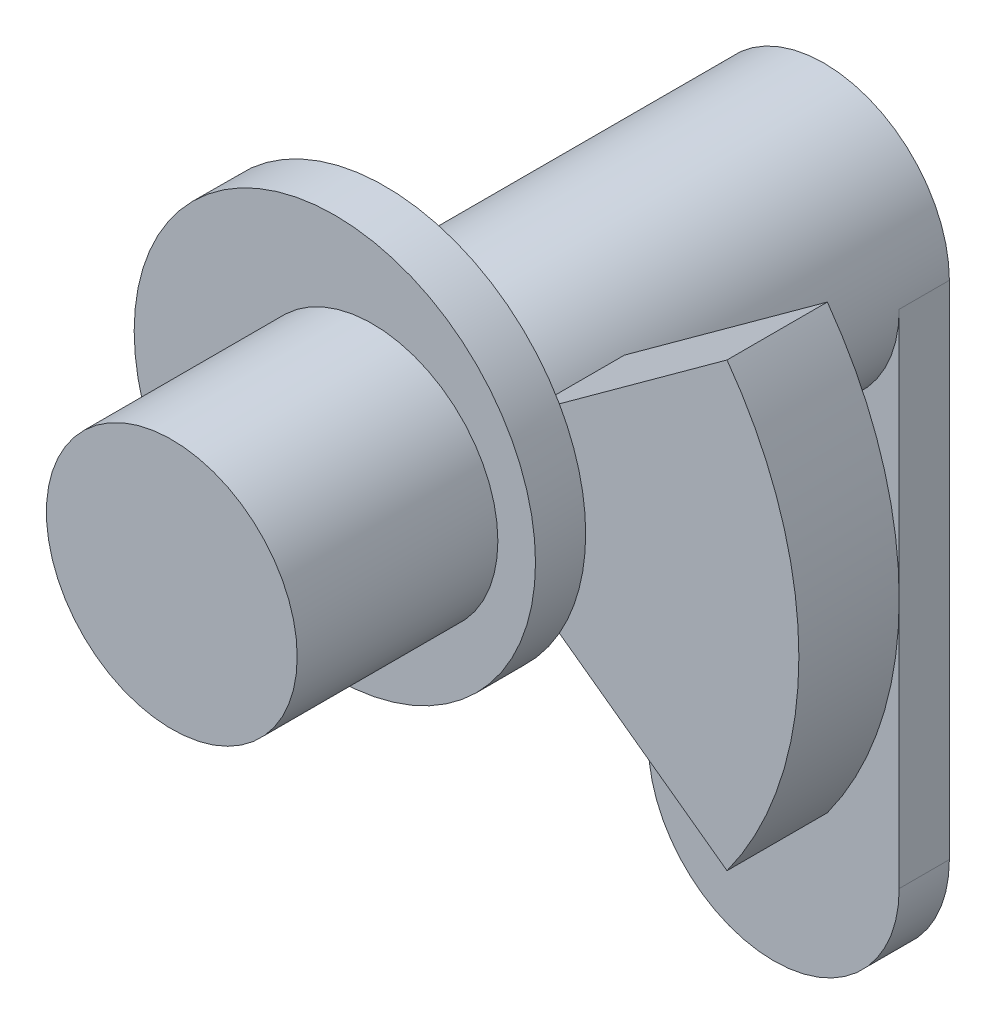
ISO-10303-21;
HEADER;
FILE_DESCRIPTION(('STEP AP214'),'2;1');
FILE_NAME('part.step','',(''),(''),'','','');
FILE_SCHEMA(('AUTOMOTIVE_DESIGN { 1 0 10303 214 1 1 1 1 }'));
ENDSEC;
DATA;
#1=APPLICATION_CONTEXT('core data for automotive mechanical design processes');
#2=APPLICATION_PROTOCOL_DEFINITION('international standard','automotive_design',2000,#1);
#3=PRODUCT_CONTEXT('',#1,'mechanical');
#4=PRODUCT('Part','Part','',(#3));
#5=PRODUCT_RELATED_PRODUCT_CATEGORY('part','',(#4));
#6=PRODUCT_DEFINITION_FORMATION('','',#4);
#7=PRODUCT_DEFINITION_CONTEXT('part definition',#1,'design');
#8=PRODUCT_DEFINITION('design','',#6,#7);
#9=PRODUCT_DEFINITION_SHAPE('','',#8);
#10=(LENGTH_UNIT() NAMED_UNIT(*) SI_UNIT(.MILLI.,.METRE.));
#11=(NAMED_UNIT(*) PLANE_ANGLE_UNIT() SI_UNIT($,.RADIAN.));
#12=(NAMED_UNIT(*) SI_UNIT($,.STERADIAN.) SOLID_ANGLE_UNIT());
#13=UNCERTAINTY_MEASURE_WITH_UNIT(LENGTH_MEASURE(1.E-05),#10,'distance_accuracy_value','');
#14=(GEOMETRIC_REPRESENTATION_CONTEXT(3) GLOBAL_UNCERTAINTY_ASSIGNED_CONTEXT((#13)) GLOBAL_UNIT_ASSIGNED_CONTEXT((#10,
#11,#12)) REPRESENTATION_CONTEXT('',''));
#15=CARTESIAN_POINT('',(0.,0.,0.));
#16=DIRECTION('',(0.,0.,1.));
#17=DIRECTION('',(1.,0.,0.));
#18=AXIS2_PLACEMENT_3D('',#15,#16,#17);
#19=CARTESIAN_POINT('',(0.,0.,330.2));
#20=DIRECTION('',(0.,0.,-1.));
#21=DIRECTION('',(-1.,0.,0.));
#22=AXIS2_PLACEMENT_3D('',#19,#20,#21);
#23=CYLINDRICAL_SURFACE('',#22,63.5);
#24=CARTESIAN_POINT('',(0.,0.,25.4));
#25=DIRECTION('',(0.,0.,-1.));
#26=DIRECTION('',(-1.,0.,0.));
#27=AXIS2_PLACEMENT_3D('',#24,#25,#26);
#28=CIRCLE('',#27,63.5);
#29=CARTESIAN_POINT('',(63.5,0.,25.4));
#30=VERTEX_POINT('',#29);
#31=CARTESIAN_POINT('',(-63.5,0.,25.4));
#32=VERTEX_POINT('',#31);
#33=EDGE_CURVE('E179',#30,#32,#28,.T.);
#34=ORIENTED_EDGE('',*,*,#33,.F.);
#35=DIRECTION('',(0.,0.,-1.));
#36=VECTOR('',#35,1.);
#37=CARTESIAN_POINT('',(63.5,0.,25.4));
#38=LINE('',#37,#36);
#39=CARTESIAN_POINT('',(63.5,0.,0.));
#40=VERTEX_POINT('',#39);
#41=EDGE_CURVE('E159',#30,#40,#38,.T.);
#42=ORIENTED_EDGE('',*,*,#41,.T.);
#43=CARTESIAN_POINT('',(0.,0.,0.));
#44=DIRECTION('',(0.,0.,1.));
#45=DIRECTION('',(1.,0.,0.));
#46=AXIS2_PLACEMENT_3D('',#43,#44,#45);
#47=CIRCLE('',#46,63.5);
#48=CARTESIAN_POINT('',(-63.5,0.,0.));
#49=VERTEX_POINT('',#48);
#50=EDGE_CURVE('E169',#40,#49,#47,.T.);
#51=ORIENTED_EDGE('',*,*,#50,.T.);
#52=DIRECTION('',(0.,0.,-1.));
#53=VECTOR('',#52,1.);
#54=CARTESIAN_POINT('',(-63.5,0.,25.4));
#55=LINE('',#54,#53);
#56=EDGE_CURVE('E58',#32,#49,#55,.T.);
#57=ORIENTED_EDGE('',*,*,#56,.F.);
#58=EDGE_LOOP('',(#34,#42,#51,#57));
#59=FACE_BOUND('',#58,.T.);
#60=CARTESIAN_POINT('',(0.,0.,152.4));
#61=DIRECTION('',(0.,0.,1.));
#62=DIRECTION('',(1.,0.,0.));
#63=AXIS2_PLACEMENT_3D('',#60,#61,#62);
#64=CIRCLE('',#63,63.5);
#65=CARTESIAN_POINT('',(51.3725791428088,-37.3243635205725,152.4));
#66=VERTEX_POINT('',#65);
#67=CARTESIAN_POINT('',(51.3725791428094,37.3243635205718,152.4));
#68=VERTEX_POINT('',#67);
#69=EDGE_CURVE('E11',#66,#68,#64,.T.);
#70=ORIENTED_EDGE('',*,*,#69,.F.);
#71=DIRECTION('',(0.,0.,-1.));
#72=VECTOR('',#71,1.);
#73=CARTESIAN_POINT('',(51.3725791428088,-37.3243635205725,330.2));
#74=LINE('',#73,#72);
#75=CARTESIAN_POINT('',(51.3725791428088,-37.3243635205725,203.2));
#76=VERTEX_POINT('',#75);
#77=EDGE_CURVE('E113',#66,#76,#74,.F.);
#78=ORIENTED_EDGE('',*,*,#77,.T.);
#79=CARTESIAN_POINT('',(0.,0.,203.2));
#80=DIRECTION('',(0.,0.,1.));
#81=DIRECTION('',(1.,0.,0.));
#82=AXIS2_PLACEMENT_3D('',#79,#80,#81);
#83=CIRCLE('',#82,63.5);
#84=CARTESIAN_POINT('',(51.3725791428094,37.3243635205718,203.2));
#85=VERTEX_POINT('',#84);
#86=EDGE_CURVE('E182',#85,#76,#83,.T.);
#87=ORIENTED_EDGE('',*,*,#86,.F.);
#88=DIRECTION('',(0.,0.,-1.));
#89=VECTOR('',#88,1.);
#90=CARTESIAN_POINT('',(51.3725791428094,37.3243635205718,330.2));
#91=LINE('',#90,#89);
#92=EDGE_CURVE('E50',#85,#68,#91,.T.);
#93=ORIENTED_EDGE('',*,*,#92,.T.);
#94=EDGE_LOOP('',(#70,#78,#87,#93));
#95=FACE_BOUND('',#94,.T.);
#96=ADVANCED_FACE('F35',(#59,#95),#23,.T.);
#97=CARTESIAN_POINT('',(0.,0.,0.));
#98=DIRECTION('',(0.,0.,1.));
#99=DIRECTION('',(1.,0.,0.));
#100=AXIS2_PLACEMENT_3D('',#97,#98,#99);
#101=PLANE('',#100);
#102=ORIENTED_EDGE('',*,*,#50,.F.);
#103=DIRECTION('',(0.,-1.,0.));
#104=VECTOR('',#103,1.);
#105=CARTESIAN_POINT('',(63.5,0.,0.));
#106=LINE('',#105,#104);
#107=CARTESIAN_POINT('',(63.5,-254.,0.));
#108=VERTEX_POINT('',#107);
#109=EDGE_CURVE('E160',#40,#108,#106,.T.);
#110=ORIENTED_EDGE('',*,*,#109,.T.);
#111=CARTESIAN_POINT('',(0.,-254.,0.));
#112=DIRECTION('',(0.,0.,-1.));
#113=DIRECTION('',(-1.,0.,0.));
#114=AXIS2_PLACEMENT_3D('',#111,#112,#113);
#115=CIRCLE('',#114,63.5);
#116=CARTESIAN_POINT('',(-63.5,-254.,0.));
#117=VERTEX_POINT('',#116);
#118=EDGE_CURVE('E163',#108,#117,#115,.T.);
#119=ORIENTED_EDGE('',*,*,#118,.T.);
#120=DIRECTION('',(0.,1.,0.));
#121=VECTOR('',#120,1.);
#122=CARTESIAN_POINT('',(-63.5,0.,0.));
#123=LINE('',#122,#121);
#124=EDGE_CURVE('E153',#117,#49,#123,.T.);
#125=ORIENTED_EDGE('',*,*,#124,.T.);
#126=EDGE_LOOP('',(#102,#110,#119,#125));
#127=FACE_BOUND('',#126,.T.);
#128=ADVANCED_FACE('F203',(#127),#101,.F.);
#129=CARTESIAN_POINT('',(-63.5,0.,25.4));
#130=DIRECTION('',(-1.,0.,0.));
#131=DIRECTION('',(0.,-1.,0.));
#132=AXIS2_PLACEMENT_3D('',#129,#130,#131);
#133=PLANE('',#132);
#134=ORIENTED_EDGE('',*,*,#124,.F.);
#135=DIRECTION('',(0.,0.,-1.));
#136=VECTOR('',#135,1.);
#137=CARTESIAN_POINT('',(-63.5,-254.,25.4));
#138=LINE('',#137,#136);
#139=CARTESIAN_POINT('',(-63.5,-254.,25.4));
#140=VERTEX_POINT('',#139);
#141=EDGE_CURVE('E170',#140,#117,#138,.T.);
#142=ORIENTED_EDGE('',*,*,#141,.F.);
#143=DIRECTION('',(0.,1.,0.));
#144=VECTOR('',#143,1.);
#145=CARTESIAN_POINT('',(-63.5,0.,25.4));
#146=LINE('',#145,#144);
#147=EDGE_CURVE('E156',#140,#32,#146,.T.);
#148=ORIENTED_EDGE('',*,*,#147,.T.);
#149=ORIENTED_EDGE('',*,*,#56,.T.);
#150=EDGE_LOOP('',(#134,#142,#148,#149));
#151=FACE_BOUND('',#150,.T.);
#152=ADVANCED_FACE('F207',(#151),#133,.T.);
#153=CARTESIAN_POINT('',(0.,-254.,25.4));
#154=DIRECTION('',(0.,0.,-1.));
#155=DIRECTION('',(-1.,0.,0.));
#156=AXIS2_PLACEMENT_3D('',#153,#154,#155);
#157=CYLINDRICAL_SURFACE('',#156,63.5);
#158=ORIENTED_EDGE('',*,*,#118,.F.);
#159=DIRECTION('',(0.,0.,-1.));
#160=VECTOR('',#159,1.);
#161=CARTESIAN_POINT('',(63.5,-254.,25.4));
#162=LINE('',#161,#160);
#163=CARTESIAN_POINT('',(63.5,-254.,25.4));
#164=VERTEX_POINT('',#163);
#165=EDGE_CURVE('E172',#164,#108,#162,.T.);
#166=ORIENTED_EDGE('',*,*,#165,.F.);
#167=CARTESIAN_POINT('',(0.,-254.,25.4));
#168=DIRECTION('',(0.,0.,-1.));
#169=DIRECTION('',(-1.,0.,0.));
#170=AXIS2_PLACEMENT_3D('',#167,#168,#169);
#171=CIRCLE('',#170,63.5);
#172=EDGE_CURVE('E152',#164,#140,#171,.T.);
#173=ORIENTED_EDGE('',*,*,#172,.T.);
#174=ORIENTED_EDGE('',*,*,#141,.T.);
#175=EDGE_LOOP('',(#158,#166,#173,#174));
#176=FACE_BOUND('',#175,.T.);
#177=ADVANCED_FACE('F242',(#176),#157,.T.);
#178=CARTESIAN_POINT('',(63.5,0.,25.4));
#179=DIRECTION('',(1.,0.,0.));
#180=DIRECTION('',(0.,1.,0.));
#181=AXIS2_PLACEMENT_3D('',#178,#179,#180);
#182=PLANE('',#181);
#183=ORIENTED_EDGE('',*,*,#109,.F.);
#184=ORIENTED_EDGE('',*,*,#41,.F.);
#185=DIRECTION('',(0.,-1.,0.));
#186=VECTOR('',#185,1.);
#187=CARTESIAN_POINT('',(63.5,0.,25.4));
#188=LINE('',#187,#186);
#189=EDGE_CURVE('E149',#30,#164,#188,.T.);
#190=ORIENTED_EDGE('',*,*,#189,.T.);
#191=ORIENTED_EDGE('',*,*,#165,.T.);
#192=EDGE_LOOP('',(#183,#184,#190,#191));
#193=FACE_BOUND('',#192,.T.);
#194=ADVANCED_FACE('F236',(#193),#182,.T.);
#195=CARTESIAN_POINT('',(0.,0.,25.4));
#196=DIRECTION('',(0.,0.,-1.));
#197=DIRECTION('',(-1.,0.,0.));
#198=AXIS2_PLACEMENT_3D('',#195,#196,#197);
#199=PLANE('',#198);
#200=ORIENTED_EDGE('',*,*,#189,.F.);
#201=ORIENTED_EDGE('',*,*,#33,.T.);
#202=ORIENTED_EDGE('',*,*,#147,.F.);
#203=ORIENTED_EDGE('',*,*,#172,.F.);
#204=EDGE_LOOP('',(#200,#201,#202,#203));
#205=FACE_BOUND('',#204,.T.);
#206=ADVANCED_FACE('F229',(#205),#199,.F.);
#207=CARTESIAN_POINT('',(-19.05,0.,203.2));
#208=DIRECTION('',(0.,0.,1.));
#209=DIRECTION('',(1.,0.,0.));
#210=AXIS2_PLACEMENT_3D('',#207,#208,#209);
#211=CYLINDRICAL_SURFACE('',#210,101.6);
#212=CARTESIAN_POINT('',(-19.05,0.,203.2));
#213=DIRECTION('',(0.,0.,1.));
#214=DIRECTION('',(1.,0.,0.));
#215=AXIS2_PLACEMENT_3D('',#212,#213,#214);
#216=CIRCLE('',#215,101.6);
#217=CARTESIAN_POINT('',(69.2270299767864,50.2963813656367,203.2));
#218=VERTEX_POINT('',#217);
#219=CARTESIAN_POINT('',(69.2270299767857,-50.2963813656378,203.2));
#220=VERTEX_POINT('',#219);
#221=EDGE_CURVE('E142',#218,#220,#216,.T.);
#222=ORIENTED_EDGE('',*,*,#221,.T.);
#223=EDGE_CURVE('E146',#220,#218,#216,.T.);
#224=ORIENTED_EDGE('',*,*,#223,.T.);
#225=EDGE_LOOP('',(#222,#224));
#226=FACE_BOUND('',#225,.T.);
#227=CARTESIAN_POINT('',(-19.05,0.,228.6));
#228=DIRECTION('',(0.,0.,1.));
#229=DIRECTION('',(1.,0.,0.));
#230=AXIS2_PLACEMENT_3D('',#227,#228,#229);
#231=CIRCLE('',#230,101.6);
#232=CARTESIAN_POINT('',(82.55,0.,228.6));
#233=VERTEX_POINT('',#232);
#234=EDGE_CURVE('E141',#233,#233,#231,.T.);
#235=ORIENTED_EDGE('',*,*,#234,.F.);
#236=EDGE_LOOP('',(#235));
#237=FACE_BOUND('',#236,.T.);
#238=ADVANCED_FACE('F195',(#226,#237),#211,.T.);
#239=CARTESIAN_POINT('',(-19.05,0.,203.2));
#240=DIRECTION('',(0.,0.,1.));
#241=DIRECTION('',(1.,0.,0.));
#242=AXIS2_PLACEMENT_3D('',#239,#240,#241);
#243=PLANE('',#242);
#244=ORIENTED_EDGE('',*,*,#86,.T.);
#245=DIRECTION('',(0.809016994374942,-0.587785252292481,0.));
#246=VECTOR('',#245,1.);
#247=CARTESIAN_POINT('',(-12.4683868714212,9.05881331771139,203.2));
#248=LINE('',#247,#246);
#249=EDGE_CURVE('E43',#76,#220,#248,.T.);
#250=ORIENTED_EDGE('',*,*,#249,.T.);
#251=ORIENTED_EDGE('',*,*,#221,.F.);
#252=DIRECTION('',(-0.809016994374951,-0.587785252292469,0.));
#253=VECTOR('',#252,1.);
#254=CARTESIAN_POINT('',(-12.4683868714215,-9.05881331771131,203.2));
#255=LINE('',#254,#253);
#256=EDGE_CURVE('E187',#218,#85,#255,.T.);
#257=ORIENTED_EDGE('',*,*,#256,.T.);
#258=EDGE_LOOP('',(#244,#250,#251,#257));
#259=FACE_BOUND('',#258,.T.);
#260=ADVANCED_FACE('F191',(#259),#243,.F.);
#261=CARTESIAN_POINT('',(-19.05,0.,228.6));
#262=DIRECTION('',(0.,0.,1.));
#263=DIRECTION('',(1.,0.,0.));
#264=AXIS2_PLACEMENT_3D('',#261,#262,#263);
#265=PLANE('',#264);
#266=CARTESIAN_POINT('',(0.,0.,228.6));
#267=DIRECTION('',(0.,0.,1.));
#268=DIRECTION('',(1.,0.,0.));
#269=AXIS2_PLACEMENT_3D('',#266,#267,#268);
#270=CIRCLE('',#269,63.5);
#271=CARTESIAN_POINT('',(63.5,0.,228.6));
#272=VERTEX_POINT('',#271);
#273=EDGE_CURVE('E145',#272,#272,#270,.T.);
#274=ORIENTED_EDGE('',*,*,#273,.F.);
#275=EDGE_LOOP('',(#274));
#276=FACE_BOUND('',#275,.T.);
#277=ORIENTED_EDGE('',*,*,#234,.T.);
#278=EDGE_LOOP('',(#277));
#279=FACE_BOUND('',#278,.T.);
#280=ADVANCED_FACE('F217',(#276,#279),#265,.T.);
#281=CARTESIAN_POINT('',(0.,0.,330.2));
#282=DIRECTION('',(0.,0.,1.));
#283=DIRECTION('',(1.,0.,0.));
#284=AXIS2_PLACEMENT_3D('',#281,#282,#283);
#285=PLANE('',#284);
#286=CARTESIAN_POINT('',(0.,0.,330.2));
#287=DIRECTION('',(0.,0.,1.));
#288=DIRECTION('',(1.,0.,0.));
#289=AXIS2_PLACEMENT_3D('',#286,#287,#288);
#290=CIRCLE('',#289,63.5);
#291=CARTESIAN_POINT('',(63.5,0.,330.2));
#292=VERTEX_POINT('',#291);
#293=EDGE_CURVE('E176',#292,#292,#290,.T.);
#294=ORIENTED_EDGE('',*,*,#293,.T.);
#295=EDGE_LOOP('',(#294));
#296=FACE_BOUND('',#295,.T.);
#297=ADVANCED_FACE('F210',(#296),#285,.T.);
#298=ORIENTED_EDGE('',*,*,#273,.T.);
#299=EDGE_LOOP('',(#298));
#300=FACE_BOUND('',#299,.T.);
#301=ORIENTED_EDGE('',*,*,#293,.F.);
#302=EDGE_LOOP('',(#301));
#303=FACE_BOUND('',#302,.T.);
#304=ADVANCED_FACE('F37',(#300,#303),#23,.T.);
#305=CARTESIAN_POINT('',(0.,0.,152.4));
#306=DIRECTION('',(-0.587785252292481,-0.809016994374942,0.));
#307=DIRECTION('',(0.809016994374942,-0.587785252292481,0.));
#308=AXIS2_PLACEMENT_3D('',#305,#306,#307);
#309=PLANE('',#308);
#310=ORIENTED_EDGE('',*,*,#77,.F.);
#311=DIRECTION('',(0.809016994374942,-0.587785252292481,0.));
#312=VECTOR('',#311,1.);
#313=CARTESIAN_POINT('',(0.,0.,152.4));
#314=LINE('',#313,#312);
#315=CARTESIAN_POINT('',(154.117737428426,-111.973090561718,152.4));
#316=VERTEX_POINT('',#315);
#317=EDGE_CURVE('E106',#66,#316,#314,.T.);
#318=ORIENTED_EDGE('',*,*,#317,.T.);
#319=DIRECTION('',(0.,0.,1.));
#320=VECTOR('',#319,1.);
#321=CARTESIAN_POINT('',(154.117737428426,-111.973090561718,152.4));
#322=LINE('',#321,#320);
#323=CARTESIAN_POINT('',(154.117737428426,-111.973090561718,203.2));
#324=VERTEX_POINT('',#323);
#325=EDGE_CURVE('E110',#316,#324,#322,.T.);
#326=ORIENTED_EDGE('',*,*,#325,.T.);
#327=DIRECTION('',(0.809016994374942,-0.587785252292481,0.));
#328=VECTOR('',#327,1.);
#329=CARTESIAN_POINT('',(0.,0.,203.2));
#330=LINE('',#329,#328);
#331=EDGE_CURVE('E133',#220,#324,#330,.T.);
#332=ORIENTED_EDGE('',*,*,#331,.F.);
#333=ORIENTED_EDGE('',*,*,#249,.F.);
#334=EDGE_LOOP('',(#310,#318,#326,#332,#333));
#335=FACE_BOUND('',#334,.T.);
#336=ADVANCED_FACE('F108',(#335),#309,.T.);
#337=CARTESIAN_POINT('',(0.,0.,152.4));
#338=DIRECTION('',(-0.587785252292469,0.809016994374951,0.));
#339=DIRECTION('',(-0.809016994374951,-0.587785252292469,0.));
#340=AXIS2_PLACEMENT_3D('',#337,#338,#339);
#341=PLANE('',#340);
#342=ORIENTED_EDGE('',*,*,#92,.F.);
#343=ORIENTED_EDGE('',*,*,#256,.F.);
#344=DIRECTION('',(-0.809016994374951,-0.587785252292469,0.));
#345=VECTOR('',#344,1.);
#346=CARTESIAN_POINT('',(0.,0.,203.2));
#347=LINE('',#346,#345);
#348=CARTESIAN_POINT('',(154.117737428428,111.973090561715,203.2));
#349=VERTEX_POINT('',#348);
#350=EDGE_CURVE('E118',#349,#218,#347,.T.);
#351=ORIENTED_EDGE('',*,*,#350,.F.);
#352=DIRECTION('',(0.,0.,1.));
#353=VECTOR('',#352,1.);
#354=CARTESIAN_POINT('',(154.117737428428,111.973090561715,152.4));
#355=LINE('',#354,#353);
#356=CARTESIAN_POINT('',(154.117737428428,111.973090561715,152.4));
#357=VERTEX_POINT('',#356);
#358=EDGE_CURVE('E126',#357,#349,#355,.T.);
#359=ORIENTED_EDGE('',*,*,#358,.F.);
#360=DIRECTION('',(-0.809016994374951,-0.587785252292469,0.));
#361=VECTOR('',#360,1.);
#362=CARTESIAN_POINT('',(0.,0.,152.4));
#363=LINE('',#362,#361);
#364=EDGE_CURVE('E127',#357,#68,#363,.T.);
#365=ORIENTED_EDGE('',*,*,#364,.T.);
#366=EDGE_LOOP('',(#342,#343,#351,#359,#365));
#367=FACE_BOUND('',#366,.T.);
#368=ADVANCED_FACE('F200',(#367),#341,.T.);
#369=CARTESIAN_POINT('',(0.,0.,152.4));
#370=DIRECTION('',(0.,0.,1.));
#371=DIRECTION('',(1.,0.,0.));
#372=AXIS2_PLACEMENT_3D('',#369,#370,#371);
#373=CYLINDRICAL_SURFACE('',#372,190.5);
#374=CARTESIAN_POINT('',(0.,0.,203.2));
#375=DIRECTION('',(0.,0.,1.));
#376=DIRECTION('',(1.,0.,0.));
#377=AXIS2_PLACEMENT_3D('',#374,#375,#376);
#378=CIRCLE('',#377,190.5);
#379=EDGE_CURVE('E125',#324,#349,#378,.T.);
#380=ORIENTED_EDGE('',*,*,#379,.F.);
#381=ORIENTED_EDGE('',*,*,#325,.F.);
#382=CARTESIAN_POINT('',(0.,0.,152.4));
#383=DIRECTION('',(0.,0.,1.));
#384=DIRECTION('',(1.,0.,0.));
#385=AXIS2_PLACEMENT_3D('',#382,#383,#384);
#386=CIRCLE('',#385,190.5);
#387=EDGE_CURVE('E117',#316,#357,#386,.T.);
#388=ORIENTED_EDGE('',*,*,#387,.T.);
#389=ORIENTED_EDGE('',*,*,#358,.T.);
#390=EDGE_LOOP('',(#380,#381,#388,#389));
#391=FACE_BOUND('',#390,.T.);
#392=ADVANCED_FACE('F122',(#391),#373,.T.);
#393=CARTESIAN_POINT('',(0.,0.,152.4));
#394=DIRECTION('',(0.,0.,1.));
#395=DIRECTION('',(1.,0.,0.));
#396=AXIS2_PLACEMENT_3D('',#393,#394,#395);
#397=PLANE('',#396);
#398=ORIENTED_EDGE('',*,*,#317,.F.);
#399=ORIENTED_EDGE('',*,*,#69,.T.);
#400=ORIENTED_EDGE('',*,*,#364,.F.);
#401=ORIENTED_EDGE('',*,*,#387,.F.);
#402=EDGE_LOOP('',(#398,#399,#400,#401));
#403=FACE_BOUND('',#402,.T.);
#404=ADVANCED_FACE('F129',(#403),#397,.F.);
#405=CARTESIAN_POINT('',(0.,0.,203.2));
#406=DIRECTION('',(0.,0.,1.));
#407=DIRECTION('',(1.,0.,0.));
#408=AXIS2_PLACEMENT_3D('',#405,#406,#407);
#409=PLANE('',#408);
#410=ORIENTED_EDGE('',*,*,#350,.T.);
#411=ORIENTED_EDGE('',*,*,#223,.F.);
#412=ORIENTED_EDGE('',*,*,#331,.T.);
#413=ORIENTED_EDGE('',*,*,#379,.T.);
#414=EDGE_LOOP('',(#410,#411,#412,#413));
#415=FACE_BOUND('',#414,.T.);
#416=ADVANCED_FACE('F198',(#415),#409,.T.);
#417=CLOSED_SHELL('',(#96,#128,#152,#177,#194,#206,#238,#260,#280,#297,#304,#336,#368,#392,#404,#416));
#418=MANIFOLD_SOLID_BREP('B2',#417);
#419=ADVANCED_BREP_SHAPE_REPRESENTATION('',(#18,#418),#14);
#420=SHAPE_DEFINITION_REPRESENTATION(#9,#419);
ENDSEC;
END-ISO-10303-21;
